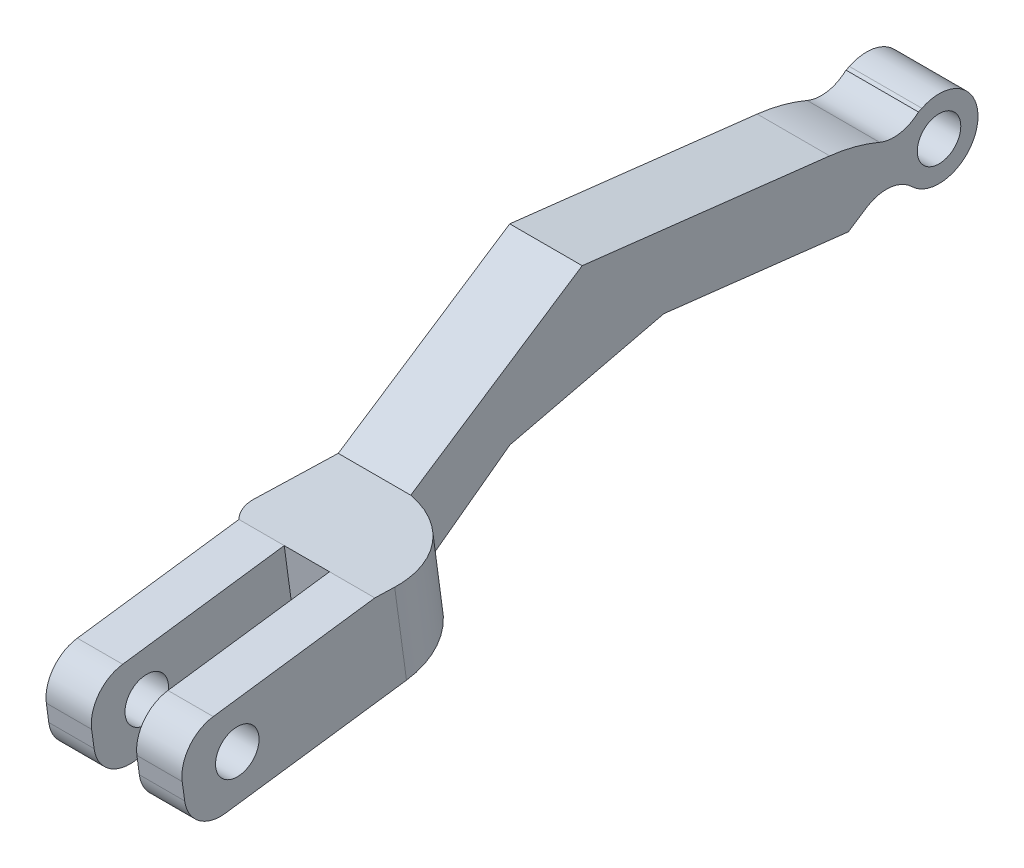
ISO-10303-21;
HEADER;
FILE_DESCRIPTION(('STEP AP214'),'2;1');
FILE_NAME('part.step','',(''),(''),'','','');
FILE_SCHEMA(('AUTOMOTIVE_DESIGN { 1 0 10303 214 1 1 1 1 }'));
ENDSEC;
DATA;
#1=APPLICATION_CONTEXT('core data for automotive mechanical design processes');
#2=APPLICATION_PROTOCOL_DEFINITION('international standard','automotive_design',2000,#1);
#3=PRODUCT_CONTEXT('',#1,'mechanical');
#4=PRODUCT('Part','Part','',(#3));
#5=PRODUCT_RELATED_PRODUCT_CATEGORY('part','',(#4));
#6=PRODUCT_DEFINITION_FORMATION('','',#4);
#7=PRODUCT_DEFINITION_CONTEXT('part definition',#1,'design');
#8=PRODUCT_DEFINITION('design','',#6,#7);
#9=PRODUCT_DEFINITION_SHAPE('','',#8);
#10=(LENGTH_UNIT() NAMED_UNIT(*) SI_UNIT(.MILLI.,.METRE.));
#11=(NAMED_UNIT(*) PLANE_ANGLE_UNIT() SI_UNIT($,.RADIAN.));
#12=(NAMED_UNIT(*) SI_UNIT($,.STERADIAN.) SOLID_ANGLE_UNIT());
#13=UNCERTAINTY_MEASURE_WITH_UNIT(LENGTH_MEASURE(1.E-05),#10,'distance_accuracy_value','');
#14=(GEOMETRIC_REPRESENTATION_CONTEXT(3) GLOBAL_UNCERTAINTY_ASSIGNED_CONTEXT((#13)) GLOBAL_UNIT_ASSIGNED_CONTEXT((#10,
#11,#12)) REPRESENTATION_CONTEXT('',''));
#15=CARTESIAN_POINT('',(0.,0.,0.));
#16=DIRECTION('',(0.,0.,1.));
#17=DIRECTION('',(1.,0.,0.));
#18=AXIS2_PLACEMENT_3D('',#15,#16,#17);
#19=CARTESIAN_POINT('',(2.,0.,0.));
#20=DIRECTION('',(1.,0.,0.));
#21=DIRECTION('',(0.,0.,-1.));
#22=AXIS2_PLACEMENT_3D('',#19,#20,#21);
#23=PLANE('',#22);
#24=CARTESIAN_POINT('',(2.,-2.82842712474619,-2.82842712474619));
#25=DIRECTION('',(1.,0.,0.));
#26=DIRECTION('',(0.,0.,-1.));
#27=AXIS2_PLACEMENT_3D('',#24,#25,#26);
#28=CIRCLE('',#27,1.2);
#29=CARTESIAN_POINT('',(2.,-2.82842712474619,-4.02842712474618));
#30=VERTEX_POINT('',#29);
#31=EDGE_CURVE('E308',#30,#30,#28,.T.);
#32=ORIENTED_EDGE('',*,*,#31,.F.);
#33=EDGE_LOOP('',(#32));
#34=FACE_BOUND('',#33,.T.);
#35=CARTESIAN_POINT('',(2.,0.484049290264182,-0.328427124746185));
#36=DIRECTION('',(1.,0.,0.));
#37=DIRECTION('',(0.,0.,-1.));
#38=AXIS2_PLACEMENT_3D('',#35,#36,#37);
#39=CIRCLE('',#38,2.);
#40=CARTESIAN_POINT('',(2.,-1.35709444230002,0.452719312254937));
#41=VERTEX_POINT('',#40);
#42=CARTESIAN_POINT('',(2.,-0.979731912227501,-1.69127142665011));
#43=VERTEX_POINT('',#42);
#44=EDGE_CURVE('E284',#41,#43,#39,.T.);
#45=ORIENTED_EDGE('',*,*,#44,.F.);
#46=CARTESIAN_POINT('',(2.,-10.562813105121,4.35845149726054));
#47=DIRECTION('',(1.,0.,0.));
#48=DIRECTION('',(0.,0.,-1.));
#49=AXIS2_PLACEMENT_3D('',#46,#47,#48);
#50=CIRCLE('',#49,10.);
#51=CARTESIAN_POINT('',(2.,-0.629231745712857,3.20781629181178));
#52=VERTEX_POINT('',#51);
#53=EDGE_CURVE('E63',#41,#52,#50,.T.);
#54=ORIENTED_EDGE('',*,*,#53,.T.);
#55=DIRECTION('',(0.,0.115063520544877,0.993358135940819));
#56=VECTOR('',#55,1.);
#57=CARTESIAN_POINT('',(2.,-0.987552066700199,0.114390986900482));
#58=LINE('',#57,#56);
#59=CARTESIAN_POINT('',(2.,0.952983865511063,16.8672866676453));
#60=VERTEX_POINT('',#59);
#61=EDGE_CURVE('E286',#52,#60,#58,.T.);
#62=ORIENTED_EDGE('',*,*,#61,.T.);
#63=DIRECTION('',(0.,-0.550374531244968,0.834917885397649));
#64=VECTOR('',#63,1.);
#65=CARTESIAN_POINT('',(2.,8.41512757073982,5.54721844281332));
#66=LINE('',#65,#64);
#67=CARTESIAN_POINT('',(2.,-5.28506014111271,26.3303962691135));
#68=VERTEX_POINT('',#67);
#69=EDGE_CURVE('E288',#60,#68,#66,.T.);
#70=ORIENTED_EDGE('',*,*,#69,.T.);
#71=DIRECTION('',(0.,-0.990856207200545,-0.134922113280778));
#72=VECTOR('',#71,1.);
#73=CARTESIAN_POINT('',(2.,-3.61627801369068,26.5576296553513));
#74=LINE('',#73,#72);
#75=CARTESIAN_POINT('',(2.,-9.24848496991489,25.7907078159904));
#76=VERTEX_POINT('',#75);
#77=EDGE_CURVE('E345',#68,#76,#74,.T.);
#78=ORIENTED_EDGE('',*,*,#77,.T.);
#79=DIRECTION('',(0.,-0.592706629550145,0.805418432423363));
#80=VECTOR('',#79,1.);
#81=CARTESIAN_POINT('',(2.,6.31240513743532,4.64529271090441));
#82=LINE('',#81,#80);
#83=CARTESIAN_POINT('',(2.,-5.61916698864485,20.8588925578094));
#84=VERTEX_POINT('',#83);
#85=EDGE_CURVE('E291',#84,#76,#82,.T.);
#86=ORIENTED_EDGE('',*,*,#85,.F.);
#87=DIRECTION('',(0.,-0.231624150850534,0.972805351929547));
#88=VECTOR('',#87,1.);
#89=CARTESIAN_POINT('',(2.,-5.61916698864485,20.8588925578094));
#90=LINE('',#89,#88);
#91=CARTESIAN_POINT('',(2.,-3.59576628097659,12.3607500701208));
#92=VERTEX_POINT('',#91);
#93=EDGE_CURVE('E419',#84,#92,#90,.F.);
#94=ORIENTED_EDGE('',*,*,#93,.T.);
#95=DIRECTION('',(0.,0.115063520544877,0.993358135940819));
#96=VECTOR('',#95,1.);
#97=CARTESIAN_POINT('',(2.,-4.96098461046348,0.574645069079989));
#98=LINE('',#97,#96);
#99=CARTESIAN_POINT('',(2.,-4.77600788476289,2.17157287525382));
#100=VERTEX_POINT('',#99);
#101=EDGE_CURVE('E293',#100,#92,#98,.T.);
#102=ORIENTED_EDGE('',*,*,#101,.F.);
#103=DIRECTION('',(0.,0.550374531244962,-0.834917885397653));
#104=VECTOR('',#103,1.);
#105=CARTESIAN_POINT('',(2.,-2.33142136393589,-1.53686363982916));
#106=LINE('',#105,#104);
#107=CARTESIAN_POINT('',(2.,-4.12127803589526,1.17834802582853));
#108=VERTEX_POINT('',#107);
#109=EDGE_CURVE('E296',#100,#108,#106,.T.);
#110=ORIENTED_EDGE('',*,*,#109,.T.);
#111=CARTESIAN_POINT('',(2.,-5.79111380669057,0.0775989633386117));
#112=DIRECTION('',(1.,0.,0.));
#113=DIRECTION('',(0.,0.,-1.));
#114=AXIS2_PLACEMENT_3D('',#111,#112,#113);
#115=CIRCLE('',#114,2.);
#116=CARTESIAN_POINT('',(2.,-4.36331299611497,-1.32289553694322));
#117=VERTEX_POINT('',#116);
#118=EDGE_CURVE('E299',#117,#108,#115,.T.);
#119=ORIENTED_EDGE('',*,*,#118,.F.);
#120=CARTESIAN_POINT('',(2.,-2.82842712474619,-2.82842712474619));
#121=DIRECTION('',(1.,0.,0.));
#122=DIRECTION('',(0.,0.,-1.));
#123=AXIS2_PLACEMENT_3D('',#120,#121,#122);
#124=CIRCLE('',#123,2.15);
#125=CARTESIAN_POINT('',(2.,-0.898489386493159,-1.88088275825628));
#126=VERTEX_POINT('',#125);
#127=EDGE_CURVE('E302',#117,#126,#124,.T.);
#128=ORIENTED_EDGE('',*,*,#127,.T.);
#129=CARTESIAN_POINT('',(2.,0.896801532811989,-0.999446138265666));
#130=DIRECTION('',(1.,0.,0.));
#131=DIRECTION('',(0.,0.,-1.));
#132=AXIS2_PLACEMENT_3D('',#129,#130,#131);
#133=CIRCLE('',#132,2.);
#134=EDGE_CURVE('E305',#43,#126,#133,.T.);
#135=ORIENTED_EDGE('',*,*,#134,.F.);
#136=EDGE_LOOP('',(#45,#54,#62,#70,#78,#86,#94,#102,#110,#119,#128,#135));
#137=FACE_BOUND('',#136,.T.);
#138=ADVANCED_FACE('F41',(#34,#137),#23,.T.);
#139=CARTESIAN_POINT('',(-2.,0.484049290264182,-0.328427124746185));
#140=DIRECTION('',(1.,0.,0.));
#141=DIRECTION('',(0.,0.,-1.));
#142=AXIS2_PLACEMENT_3D('',#139,#140,#141);
#143=CYLINDRICAL_SURFACE('',#142,2.);
#144=CARTESIAN_POINT('',(-2.,0.484049290264182,-0.328427124746185));
#145=DIRECTION('',(1.,0.,0.));
#146=DIRECTION('',(0.,0.,-1.));
#147=AXIS2_PLACEMENT_3D('',#144,#145,#146);
#148=CIRCLE('',#147,2.);
#149=CARTESIAN_POINT('',(-2.,-1.35709444230002,0.452719312254937));
#150=VERTEX_POINT('',#149);
#151=CARTESIAN_POINT('',(-2.,-0.979731912227501,-1.69127142665011));
#152=VERTEX_POINT('',#151);
#153=EDGE_CURVE('E311',#150,#152,#148,.T.);
#154=ORIENTED_EDGE('',*,*,#153,.F.);
#155=DIRECTION('',(1.,0.,0.));
#156=VECTOR('',#155,1.);
#157=CARTESIAN_POINT('',(-2.,-1.35709444230002,0.452719312254937));
#158=LINE('',#157,#156);
#159=EDGE_CURVE('E423',#150,#41,#158,.T.);
#160=ORIENTED_EDGE('',*,*,#159,.T.);
#161=ORIENTED_EDGE('',*,*,#44,.T.);
#162=DIRECTION('',(1.,0.,0.));
#163=VECTOR('',#162,1.);
#164=CARTESIAN_POINT('',(-2.,-0.979731912227501,-1.69127142665011));
#165=LINE('',#164,#163);
#166=EDGE_CURVE('E342',#152,#43,#165,.T.);
#167=ORIENTED_EDGE('',*,*,#166,.F.);
#168=EDGE_LOOP('',(#154,#160,#161,#167));
#169=FACE_BOUND('',#168,.T.);
#170=ADVANCED_FACE('F429',(#169),#143,.F.);
#171=CARTESIAN_POINT('',(-2.,0.896801532811989,-0.999446138265666));
#172=DIRECTION('',(1.,0.,0.));
#173=DIRECTION('',(0.,0.,-1.));
#174=AXIS2_PLACEMENT_3D('',#171,#172,#173);
#175=CYLINDRICAL_SURFACE('',#174,2.);
#176=ORIENTED_EDGE('',*,*,#166,.T.);
#177=ORIENTED_EDGE('',*,*,#134,.T.);
#178=DIRECTION('',(1.,0.,0.));
#179=VECTOR('',#178,1.);
#180=CARTESIAN_POINT('',(-2.,-0.898489386493159,-1.88088275825628));
#181=LINE('',#180,#179);
#182=CARTESIAN_POINT('',(-2.,-0.898489386493159,-1.88088275825628));
#183=VERTEX_POINT('',#182);
#184=EDGE_CURVE('E346',#183,#126,#181,.T.);
#185=ORIENTED_EDGE('',*,*,#184,.F.);
#186=CARTESIAN_POINT('',(-2.,0.896801532811989,-0.999446138265666));
#187=DIRECTION('',(1.,0.,0.));
#188=DIRECTION('',(0.,0.,-1.));
#189=AXIS2_PLACEMENT_3D('',#186,#187,#188);
#190=CIRCLE('',#189,2.);
#191=EDGE_CURVE('E336',#152,#183,#190,.T.);
#192=ORIENTED_EDGE('',*,*,#191,.F.);
#193=EDGE_LOOP('',(#176,#177,#185,#192));
#194=FACE_BOUND('',#193,.T.);
#195=ADVANCED_FACE('F438',(#194),#175,.F.);
#196=CARTESIAN_POINT('',(-2.,-2.82842712474619,-2.82842712474619));
#197=DIRECTION('',(1.,0.,0.));
#198=DIRECTION('',(0.,0.,-1.));
#199=AXIS2_PLACEMENT_3D('',#196,#197,#198);
#200=CYLINDRICAL_SURFACE('',#199,2.15);
#201=ORIENTED_EDGE('',*,*,#184,.T.);
#202=ORIENTED_EDGE('',*,*,#127,.F.);
#203=DIRECTION('',(1.,0.,0.));
#204=VECTOR('',#203,1.);
#205=CARTESIAN_POINT('',(-2.,-4.36331299611497,-1.32289553694322));
#206=LINE('',#205,#204);
#207=CARTESIAN_POINT('',(-2.,-4.36331299611497,-1.32289553694322));
#208=VERTEX_POINT('',#207);
#209=EDGE_CURVE('E348',#208,#117,#206,.T.);
#210=ORIENTED_EDGE('',*,*,#209,.F.);
#211=CARTESIAN_POINT('',(-2.,-2.82842712474619,-2.82842712474619));
#212=DIRECTION('',(1.,0.,0.));
#213=DIRECTION('',(0.,0.,-1.));
#214=AXIS2_PLACEMENT_3D('',#211,#212,#213);
#215=CIRCLE('',#214,2.15);
#216=EDGE_CURVE('E333',#208,#183,#215,.T.);
#217=ORIENTED_EDGE('',*,*,#216,.T.);
#218=EDGE_LOOP('',(#201,#202,#210,#217));
#219=FACE_BOUND('',#218,.T.);
#220=ADVANCED_FACE('F474',(#219),#200,.T.);
#221=CARTESIAN_POINT('',(-2.,-5.79111380669057,0.0775989633386117));
#222=DIRECTION('',(1.,0.,0.));
#223=DIRECTION('',(0.,0.,-1.));
#224=AXIS2_PLACEMENT_3D('',#221,#222,#223);
#225=CYLINDRICAL_SURFACE('',#224,2.);
#226=ORIENTED_EDGE('',*,*,#209,.T.);
#227=ORIENTED_EDGE('',*,*,#118,.T.);
#228=DIRECTION('',(1.,0.,0.));
#229=VECTOR('',#228,1.);
#230=CARTESIAN_POINT('',(-2.,-4.12127803589526,1.17834802582853));
#231=LINE('',#230,#229);
#232=CARTESIAN_POINT('',(-2.,-4.12127803589526,1.17834802582853));
#233=VERTEX_POINT('',#232);
#234=EDGE_CURVE('E350',#233,#108,#231,.T.);
#235=ORIENTED_EDGE('',*,*,#234,.F.);
#236=CARTESIAN_POINT('',(-2.,-5.79111380669057,0.0775989633386117));
#237=DIRECTION('',(1.,0.,0.));
#238=DIRECTION('',(0.,0.,-1.));
#239=AXIS2_PLACEMENT_3D('',#236,#237,#238);
#240=CIRCLE('',#239,2.);
#241=EDGE_CURVE('E331',#208,#233,#240,.T.);
#242=ORIENTED_EDGE('',*,*,#241,.F.);
#243=EDGE_LOOP('',(#226,#227,#235,#242));
#244=FACE_BOUND('',#243,.T.);
#245=ADVANCED_FACE('F477',(#244),#225,.F.);
#246=CARTESIAN_POINT('',(-2.,-2.33142136393589,-1.53686363982916));
#247=DIRECTION('',(0.,-0.834917885397653,-0.550374531244961));
#248=DIRECTION('',(0.,0.550374531244962,-0.834917885397653));
#249=AXIS2_PLACEMENT_3D('',#246,#247,#248);
#250=PLANE('',#249);
#251=ORIENTED_EDGE('',*,*,#234,.T.);
#252=ORIENTED_EDGE('',*,*,#109,.F.);
#253=DIRECTION('',(1.,0.,0.));
#254=VECTOR('',#253,1.);
#255=CARTESIAN_POINT('',(-2.,-4.77600788476289,2.17157287525382));
#256=LINE('',#255,#254);
#257=CARTESIAN_POINT('',(-2.,-4.77600788476289,2.17157287525382));
#258=VERTEX_POINT('',#257);
#259=EDGE_CURVE('E352',#258,#100,#256,.T.);
#260=ORIENTED_EDGE('',*,*,#259,.F.);
#261=DIRECTION('',(0.,0.550374531244962,-0.834917885397653));
#262=VECTOR('',#261,1.);
#263=CARTESIAN_POINT('',(-2.,-2.33142136393589,-1.53686363982916));
#264=LINE('',#263,#262);
#265=EDGE_CURVE('E328',#258,#233,#264,.T.);
#266=ORIENTED_EDGE('',*,*,#265,.T.);
#267=EDGE_LOOP('',(#251,#252,#260,#266));
#268=FACE_BOUND('',#267,.T.);
#269=ADVANCED_FACE('F481',(#268),#250,.T.);
#270=CARTESIAN_POINT('',(-2.,-4.96098461046348,0.574645069079989));
#271=DIRECTION('',(0.,0.993358135940819,-0.115063520544877));
#272=DIRECTION('',(0.,0.115063520544877,0.993358135940819));
#273=AXIS2_PLACEMENT_3D('',#270,#271,#272);
#274=PLANE('',#273);
#275=ORIENTED_EDGE('',*,*,#101,.T.);
#276=DIRECTION('',(-1.,0.,0.));
#277=VECTOR('',#276,1.);
#278=CARTESIAN_POINT('',(-2.,-3.59576628097659,12.3607500701208));
#279=LINE('',#278,#277);
#280=CARTESIAN_POINT('',(-2.,-3.59576628097659,12.3607500701208));
#281=VERTEX_POINT('',#280);
#282=EDGE_CURVE('E417',#92,#281,#279,.T.);
#283=ORIENTED_EDGE('',*,*,#282,.T.);
#284=DIRECTION('',(0.,0.115063520544877,0.993358135940819));
#285=VECTOR('',#284,1.);
#286=CARTESIAN_POINT('',(-2.,-4.96098461046348,0.574645069079989));
#287=LINE('',#286,#285);
#288=EDGE_CURVE('E325',#258,#281,#287,.T.);
#289=ORIENTED_EDGE('',*,*,#288,.F.);
#290=ORIENTED_EDGE('',*,*,#259,.T.);
#291=EDGE_LOOP('',(#275,#283,#289,#290));
#292=FACE_BOUND('',#291,.T.);
#293=ADVANCED_FACE('F485',(#292),#274,.F.);
#294=CARTESIAN_POINT('',(-2.,6.31240513743532,4.64529271090441));
#295=DIRECTION('',(0.,0.805418432423363,0.592706629550145));
#296=DIRECTION('',(0.,-0.592706629550145,0.805418432423363));
#297=AXIS2_PLACEMENT_3D('',#294,#295,#296);
#298=PLANE('',#297);
#299=DIRECTION('',(0.,-0.592706629550145,0.805418432423363));
#300=VECTOR('',#299,1.);
#301=CARTESIAN_POINT('',(-2.,6.31240513743532,4.64529271090441));
#302=LINE('',#301,#300);
#303=CARTESIAN_POINT('',(-2.,-5.61916698864485,20.8588925578094));
#304=VERTEX_POINT('',#303);
#305=CARTESIAN_POINT('',(-2.,-9.24848496991489,25.7907078159904));
#306=VERTEX_POINT('',#305);
#307=EDGE_CURVE('E323',#304,#306,#302,.T.);
#308=ORIENTED_EDGE('',*,*,#307,.F.);
#309=DIRECTION('',(1.,0.,0.));
#310=VECTOR('',#309,1.);
#311=CARTESIAN_POINT('',(2.,-5.61916698864485,20.8588925578094));
#312=LINE('',#311,#310);
#313=EDGE_CURVE('E414',#304,#84,#312,.T.);
#314=ORIENTED_EDGE('',*,*,#313,.T.);
#315=ORIENTED_EDGE('',*,*,#85,.T.);
#316=DIRECTION('',(1.,0.,0.));
#317=VECTOR('',#316,1.);
#318=CARTESIAN_POINT('',(-2.,-9.24848496991489,25.7907078159904));
#319=LINE('',#318,#317);
#320=EDGE_CURVE('E354',#306,#76,#319,.T.);
#321=ORIENTED_EDGE('',*,*,#320,.F.);
#322=EDGE_LOOP('',(#308,#314,#315,#321));
#323=FACE_BOUND('',#322,.T.);
#324=ADVANCED_FACE('F489',(#323),#298,.F.);
#325=CARTESIAN_POINT('',(-2.,-5.6322069562242,-0.766921839360963));
#326=DIRECTION('',(0.,0.990856207200545,0.134922113280778));
#327=DIRECTION('',(0.,-0.134922113280778,0.990856207200545));
#328=AXIS2_PLACEMENT_3D('',#325,#326,#327);
#329=PLANE('',#328);
#330=DIRECTION('',(0.,-0.134922113280778,0.990856207200545));
#331=VECTOR('',#330,1.);
#332=CARTESIAN_POINT('',(6.1,-5.6322069562242,-0.766921839360963));
#333=LINE('',#332,#331);
#334=CARTESIAN_POINT('',(6.1,-9.91207685896684,30.664068648597));
#335=VERTEX_POINT('',#334);
#336=CARTESIAN_POINT('',(6.1,-11.2723166691266,40.6535509239985));
#337=VERTEX_POINT('',#336);
#338=EDGE_CURVE('E249',#335,#337,#333,.T.);
#339=ORIENTED_EDGE('',*,*,#338,.T.);
#340=DIRECTION('',(-1.,0.,0.));
#341=VECTOR('',#340,1.);
#342=CARTESIAN_POINT('',(-2.,-11.2723166691266,40.6535509239985));
#343=LINE('',#342,#341);
#344=CARTESIAN_POINT('',(3.6,-11.2723166691266,40.6535509239985));
#345=VERTEX_POINT('',#344);
#346=EDGE_CURVE('E381',#337,#345,#343,.T.);
#347=ORIENTED_EDGE('',*,*,#346,.T.);
#348=DIRECTION('',(0.,-0.134922113280778,0.990856207200545));
#349=VECTOR('',#348,1.);
#350=CARTESIAN_POINT('',(3.6,-5.6322069562242,-0.766921839360963));
#351=LINE('',#350,#349);
#352=CARTESIAN_POINT('',(3.6,-10.0580176495996,31.7358450591937));
#353=VERTEX_POINT('',#352);
#354=EDGE_CURVE('E241',#353,#345,#351,.T.);
#355=ORIENTED_EDGE('',*,*,#354,.F.);
#356=DIRECTION('',(1.,0.,0.));
#357=VECTOR('',#356,1.);
#358=CARTESIAN_POINT('',(-2.,-10.0580176495996,31.7358450591937));
#359=LINE('',#358,#357);
#360=CARTESIAN_POINT('',(1.1,-10.0580176495996,31.7358450591936));
#361=VERTEX_POINT('',#360);
#362=EDGE_CURVE('E357',#361,#353,#359,.T.);
#363=ORIENTED_EDGE('',*,*,#362,.F.);
#364=DIRECTION('',(0.,-0.134922113280778,0.990856207200545));
#365=VECTOR('',#364,1.);
#366=CARTESIAN_POINT('',(1.1,-5.6322069562242,-0.766921839360963));
#367=LINE('',#366,#365);
#368=CARTESIAN_POINT('',(1.1,-11.2723166691266,40.6535509239985));
#369=VERTEX_POINT('',#368);
#370=EDGE_CURVE('E252',#361,#369,#367,.T.);
#371=ORIENTED_EDGE('',*,*,#370,.T.);
#372=DIRECTION('',(1.,0.,0.));
#373=VECTOR('',#372,1.);
#374=CARTESIAN_POINT('',(-1.4,-11.2723166691266,40.6535509239985));
#375=LINE('',#374,#373);
#376=CARTESIAN_POINT('',(-1.4,-11.2723166691266,40.6535509239985));
#377=VERTEX_POINT('',#376);
#378=EDGE_CURVE('E379',#369,#377,#375,.F.);
#379=ORIENTED_EDGE('',*,*,#378,.T.);
#380=DIRECTION('',(0.,-0.134922113280778,0.990856207200545));
#381=VECTOR('',#380,1.);
#382=CARTESIAN_POINT('',(-1.4,-5.6322069562242,-0.766921839360963));
#383=LINE('',#382,#381);
#384=CARTESIAN_POINT('',(-1.4,-10.0580176495996,31.7358450591936));
#385=VERTEX_POINT('',#384);
#386=EDGE_CURVE('E253',#385,#377,#383,.T.);
#387=ORIENTED_EDGE('',*,*,#386,.F.);
#388=CARTESIAN_POINT('',(0.,-9.86531032651507,30.3206193218536));
#389=DIRECTION('',(0.,0.990856207200545,0.134922113280778));
#390=DIRECTION('',(0.,-0.134922113280778,0.990856207200545));
#391=AXIS2_PLACEMENT_3D('',#388,#389,#390);
#392=CIRCLE('',#391,2.);
#393=CARTESIAN_POINT('',(-2.,-9.86531032651507,30.3206193218536));
#394=VERTEX_POINT('',#393);
#395=EDGE_CURVE('E368',#385,#394,#392,.F.);
#396=ORIENTED_EDGE('',*,*,#395,.T.);
#397=DIRECTION('',(0.,-0.134922113280778,0.990856207200545));
#398=VECTOR('',#397,1.);
#399=CARTESIAN_POINT('',(-2.,-5.6322069562242,-0.766921839360963));
#400=LINE('',#399,#398);
#401=EDGE_CURVE('E320',#306,#394,#400,.T.);
#402=ORIENTED_EDGE('',*,*,#401,.F.);
#403=ORIENTED_EDGE('',*,*,#320,.T.);
#404=CARTESIAN_POINT('',(1.1,-9.91207685896684,30.664068648597));
#405=DIRECTION('',(0.,0.990856207200545,0.134922113280778));
#406=DIRECTION('',(0.,-0.134922113280778,0.990856207200545));
#407=AXIS2_PLACEMENT_3D('',#404,#405,#406);
#408=CIRCLE('',#407,5.);
#409=EDGE_CURVE('E374',#76,#335,#408,.F.);
#410=ORIENTED_EDGE('',*,*,#409,.T.);
#411=EDGE_LOOP('',(#339,#347,#355,#363,#371,#379,#387,#396,#402,#403,#410));
#412=FACE_BOUND('',#411,.T.);
#413=ADVANCED_FACE('F493',(#412),#329,.F.);
#414=CARTESIAN_POINT('',(-2.,-4.42581069337535,32.5027668985546));
#415=DIRECTION('',(0.,-0.134922113280778,0.990856207200545));
#416=DIRECTION('',(0.,-0.990856207200545,-0.134922113280778));
#417=AXIS2_PLACEMENT_3D('',#414,#415,#416);
#418=PLANE('',#417);
#419=DIRECTION('',(0.,0.990856207200545,0.134922113280778));
#420=VECTOR('',#419,1.);
#421=CARTESIAN_POINT('',(1.1,-4.42581069337535,32.5027668985546));
#422=LINE('',#421,#420);
#423=CARTESIAN_POINT('',(1.1,-5.10373661359683,32.4104556255975));
#424=VERTEX_POINT('',#423);
#425=EDGE_CURVE('E278',#361,#424,#422,.T.);
#426=ORIENTED_EDGE('',*,*,#425,.F.);
#427=ORIENTED_EDGE('',*,*,#362,.T.);
#428=DIRECTION('',(0.,0.990856207200545,0.134922113280778));
#429=VECTOR('',#428,1.);
#430=CARTESIAN_POINT('',(3.6,-4.42581069337535,32.5027668985546));
#431=LINE('',#430,#429);
#432=CARTESIAN_POINT('',(3.6,-5.10373661359683,32.4104556255975));
#433=VERTEX_POINT('',#432);
#434=EDGE_CURVE('E222',#353,#433,#431,.T.);
#435=ORIENTED_EDGE('',*,*,#434,.T.);
#436=DIRECTION('',(1.,0.,0.));
#437=VECTOR('',#436,1.);
#438=CARTESIAN_POINT('',(-2.,-5.10373661359683,32.4104556255975));
#439=LINE('',#438,#437);
#440=EDGE_CURVE('E218',#424,#433,#439,.T.);
#441=ORIENTED_EDGE('',*,*,#440,.F.);
#442=EDGE_LOOP('',(#426,#427,#435,#441));
#443=FACE_BOUND('',#442,.T.);
#444=ADVANCED_FACE('F497',(#443),#418,.T.);
#445=CARTESIAN_POINT('',(-2.,-6.06490845541673,0.180871687383158));
#446=DIRECTION('',(0.,-0.99955560096244,0.0298094042982452));
#447=DIRECTION('',(0.,-0.0298094042982452,-0.99955560096244));
#448=AXIS2_PLACEMENT_3D('',#445,#446,#447);
#449=PLANE('',#448);
#450=DIRECTION('',(0.,-0.0298094042982452,-0.99955560096244));
#451=VECTOR('',#450,1.);
#452=CARTESIAN_POINT('',(6.1,-6.06490845541673,0.180871687383158));
#453=LINE('',#452,#451);
#454=CARTESIAN_POINT('',(6.1,-5.10373661359683,32.4104556255975));
#455=VERTEX_POINT('',#454);
#456=CARTESIAN_POINT('',(6.1,-5.13642522473022,31.3143557498955));
#457=VERTEX_POINT('',#456);
#458=EDGE_CURVE('E214',#455,#457,#453,.T.);
#459=ORIENTED_EDGE('',*,*,#458,.T.);
#460=CARTESIAN_POINT('',(1.1,-5.13642522473022,31.3143557498955));
#461=DIRECTION('',(0.,-0.99955560096244,0.0298094042982452));
#462=DIRECTION('',(0.,0.0298094042982452,0.99955560096244));
#463=AXIS2_PLACEMENT_3D('',#460,#461,#462);
#464=ELLIPSE('',#463,5.06896877524852,5.);
#465=EDGE_CURVE('E377',#457,#68,#464,.F.);
#466=ORIENTED_EDGE('',*,*,#465,.T.);
#467=DIRECTION('',(1.,0.,0.));
#468=VECTOR('',#467,1.);
#469=CARTESIAN_POINT('',(-2.,-5.28506014111271,26.3303962691135));
#470=LINE('',#469,#468);
#471=CARTESIAN_POINT('',(-2.,-5.28506014111271,26.3303962691135));
#472=VERTEX_POINT('',#471);
#473=EDGE_CURVE('E361',#472,#68,#470,.T.);
#474=ORIENTED_EDGE('',*,*,#473,.F.);
#475=DIRECTION('',(0.,-0.0298094042982452,-0.99955560096244));
#476=VECTOR('',#475,1.);
#477=CARTESIAN_POINT('',(-2.,-6.06490845541673,0.180871687383158));
#478=LINE('',#477,#476);
#479=CARTESIAN_POINT('',(-2.,-5.14690024673568,30.9631120010768));
#480=VERTEX_POINT('',#479);
#481=EDGE_CURVE('E318',#480,#472,#478,.T.);
#482=ORIENTED_EDGE('',*,*,#481,.F.);
#483=CARTESIAN_POINT('',(0.,-5.14690024673568,30.9631120010768));
#484=DIRECTION('',(0.,-0.99955560096244,0.0298094042982452));
#485=DIRECTION('',(0.,0.0298094042982452,0.99955560096244));
#486=AXIS2_PLACEMENT_3D('',#483,#484,#485);
#487=ELLIPSE('',#486,2.02758751009941,2.);
#488=CARTESIAN_POINT('',(-1.4,-5.10373661359683,32.4104556255975));
#489=VERTEX_POINT('',#488);
#490=EDGE_CURVE('E372',#480,#489,#487,.F.);
#491=ORIENTED_EDGE('',*,*,#490,.T.);
#492=DIRECTION('',(1.,0.,0.));
#493=VECTOR('',#492,1.);
#494=CARTESIAN_POINT('',(-1.4,-5.10373661359683,32.4104556255975));
#495=LINE('',#494,#493);
#496=EDGE_CURVE('E266',#489,#424,#495,.T.);
#497=ORIENTED_EDGE('',*,*,#496,.T.);
#498=ORIENTED_EDGE('',*,*,#440,.T.);
#499=DIRECTION('',(-1.,0.,0.));
#500=VECTOR('',#499,1.);
#501=CARTESIAN_POINT('',(6.1,-5.10373661359683,32.4104556255975));
#502=LINE('',#501,#500);
#503=EDGE_CURVE('E210',#455,#433,#502,.T.);
#504=ORIENTED_EDGE('',*,*,#503,.F.);
#505=EDGE_LOOP('',(#459,#466,#474,#482,#491,#497,#498,#504));
#506=FACE_BOUND('',#505,.T.);
#507=ADVANCED_FACE('F212',(#506),#449,.F.);
#508=CARTESIAN_POINT('',(-2.,8.41512757073982,5.54721844281332));
#509=DIRECTION('',(0.,0.834917885397649,0.550374531244968));
#510=DIRECTION('',(0.,-0.550374531244968,0.834917885397649));
#511=AXIS2_PLACEMENT_3D('',#508,#509,#510);
#512=PLANE('',#511);
#513=ORIENTED_EDGE('',*,*,#473,.T.);
#514=ORIENTED_EDGE('',*,*,#69,.F.);
#515=DIRECTION('',(1.,0.,0.));
#516=VECTOR('',#515,1.);
#517=CARTESIAN_POINT('',(-2.,0.952983865511063,16.8672866676453));
#518=LINE('',#517,#516);
#519=CARTESIAN_POINT('',(-2.,0.952983865511063,16.8672866676453));
#520=VERTEX_POINT('',#519);
#521=EDGE_CURVE('E341',#520,#60,#518,.T.);
#522=ORIENTED_EDGE('',*,*,#521,.F.);
#523=DIRECTION('',(0.,-0.550374531244968,0.834917885397649));
#524=VECTOR('',#523,1.);
#525=CARTESIAN_POINT('',(-2.,8.41512757073982,5.54721844281332));
#526=LINE('',#525,#524);
#527=EDGE_CURVE('E315',#520,#472,#526,.T.);
#528=ORIENTED_EDGE('',*,*,#527,.T.);
#529=EDGE_LOOP('',(#513,#514,#522,#528));
#530=FACE_BOUND('',#529,.T.);
#531=ADVANCED_FACE('F504',(#530),#512,.T.);
#532=CARTESIAN_POINT('',(-2.,-0.987552066700199,0.114390986900482));
#533=DIRECTION('',(0.,0.993358135940819,-0.115063520544877));
#534=DIRECTION('',(0.,0.115063520544877,0.993358135940819));
#535=AXIS2_PLACEMENT_3D('',#532,#533,#534);
#536=PLANE('',#535);
#537=ORIENTED_EDGE('',*,*,#61,.F.);
#538=DIRECTION('',(-1.,0.,0.));
#539=VECTOR('',#538,1.);
#540=CARTESIAN_POINT('',(-2.,-0.629231745712857,3.20781629181178));
#541=LINE('',#540,#539);
#542=CARTESIAN_POINT('',(-2.,-0.629231745712857,3.20781629181178));
#543=VERTEX_POINT('',#542);
#544=EDGE_CURVE('E49',#52,#543,#541,.T.);
#545=ORIENTED_EDGE('',*,*,#544,.T.);
#546=DIRECTION('',(0.,0.115063520544877,0.993358135940819));
#547=VECTOR('',#546,1.);
#548=CARTESIAN_POINT('',(-2.,-0.987552066700199,0.114390986900482));
#549=LINE('',#548,#547);
#550=EDGE_CURVE('E313',#543,#520,#549,.T.);
#551=ORIENTED_EDGE('',*,*,#550,.T.);
#552=ORIENTED_EDGE('',*,*,#521,.T.);
#553=EDGE_LOOP('',(#537,#545,#551,#552));
#554=FACE_BOUND('',#553,.T.);
#555=ADVANCED_FACE('F470',(#554),#536,.T.);
#556=CARTESIAN_POINT('',(-2.,-2.82842712474619,-2.82842712474619));
#557=DIRECTION('',(1.,0.,0.));
#558=DIRECTION('',(0.,0.,-1.));
#559=AXIS2_PLACEMENT_3D('',#556,#557,#558);
#560=CYLINDRICAL_SURFACE('',#559,1.2);
#561=CARTESIAN_POINT('',(-2.,-2.82842712474619,-2.82842712474619));
#562=DIRECTION('',(1.,0.,0.));
#563=DIRECTION('',(0.,0.,-1.));
#564=AXIS2_PLACEMENT_3D('',#561,#562,#563);
#565=CIRCLE('',#564,1.2);
#566=CARTESIAN_POINT('',(-2.,-2.82842712474619,-4.02842712474618));
#567=VERTEX_POINT('',#566);
#568=EDGE_CURVE('E338',#567,#567,#565,.T.);
#569=ORIENTED_EDGE('',*,*,#568,.F.);
#570=EDGE_LOOP('',(#569));
#571=FACE_BOUND('',#570,.T.);
#572=ORIENTED_EDGE('',*,*,#31,.T.);
#573=EDGE_LOOP('',(#572));
#574=FACE_BOUND('',#573,.T.);
#575=ADVANCED_FACE('F467',(#571,#574),#560,.F.);
#576=CARTESIAN_POINT('',(-2.,0.,0.));
#577=DIRECTION('',(1.,0.,0.));
#578=DIRECTION('',(0.,0.,-1.));
#579=AXIS2_PLACEMENT_3D('',#576,#577,#578);
#580=PLANE('',#579);
#581=ORIENTED_EDGE('',*,*,#550,.F.);
#582=CARTESIAN_POINT('',(-2.,-10.562813105121,4.35845149726054));
#583=DIRECTION('',(1.,0.,0.));
#584=DIRECTION('',(0.,0.,-1.));
#585=AXIS2_PLACEMENT_3D('',#582,#583,#584);
#586=CIRCLE('',#585,10.);
#587=EDGE_CURVE('E11',#543,#150,#586,.F.);
#588=ORIENTED_EDGE('',*,*,#587,.T.);
#589=ORIENTED_EDGE('',*,*,#153,.T.);
#590=ORIENTED_EDGE('',*,*,#191,.T.);
#591=ORIENTED_EDGE('',*,*,#216,.F.);
#592=ORIENTED_EDGE('',*,*,#241,.T.);
#593=ORIENTED_EDGE('',*,*,#265,.F.);
#594=ORIENTED_EDGE('',*,*,#288,.T.);
#595=DIRECTION('',(0.,0.231624150850534,-0.972805351929547));
#596=VECTOR('',#595,1.);
#597=CARTESIAN_POINT('',(-2.,-0.617665679203453,-0.147065688085749));
#598=LINE('',#597,#596);
#599=EDGE_CURVE('E421',#281,#304,#598,.F.);
#600=ORIENTED_EDGE('',*,*,#599,.T.);
#601=ORIENTED_EDGE('',*,*,#307,.T.);
#602=ORIENTED_EDGE('',*,*,#401,.T.);
#603=DIRECTION('',(0.,0.990856207200545,0.134922113280778));
#604=VECTOR('',#603,1.);
#605=CARTESIAN_POINT('',(-2.,-4.23310337029086,31.0875411612146));
#606=LINE('',#605,#604);
#607=EDGE_CURVE('E370',#394,#480,#606,.T.);
#608=ORIENTED_EDGE('',*,*,#607,.T.);
#609=ORIENTED_EDGE('',*,*,#481,.T.);
#610=ORIENTED_EDGE('',*,*,#527,.F.);
#611=EDGE_LOOP('',(#581,#588,#589,#590,#591,#592,#593,#594,#600,#601,#602,#608,#609,#610));
#612=FACE_BOUND('',#611,.T.);
#613=ORIENTED_EDGE('',*,*,#568,.T.);
#614=EDGE_LOOP('',(#613));
#615=FACE_BOUND('',#614,.T.);
#616=ADVANCED_FACE('F442',(#612,#615),#580,.F.);
#617=CARTESIAN_POINT('',(-1.4,-5.90995393946395,43.4021851777606));
#618=DIRECTION('',(0.,-0.134922113280779,0.990856207200545));
#619=DIRECTION('',(0.,-0.990856207200545,-0.134922113280779));
#620=AXIS2_PLACEMENT_3D('',#617,#618,#619);
#621=PLANE('',#620);
#622=DIRECTION('',(0.,-0.990856207200545,-0.134922113280779));
#623=VECTOR('',#622,1.);
#624=CARTESIAN_POINT('',(-1.4,-5.90995393946395,43.4021851777606));
#625=LINE('',#624,#623);
#626=CARTESIAN_POINT('',(-1.4,-8.56959227408648,43.040029678242));
#627=VERTEX_POINT('',#626);
#628=CARTESIAN_POINT('',(-1.4,-9.56044848128703,42.9051075649612));
#629=VERTEX_POINT('',#628);
#630=EDGE_CURVE('E260',#627,#629,#625,.T.);
#631=ORIENTED_EDGE('',*,*,#630,.T.);
#632=DIRECTION('',(1.,0.,0.));
#633=VECTOR('',#632,1.);
#634=CARTESIAN_POINT('',(1.1,-9.56044848128703,42.9051075649612));
#635=LINE('',#634,#633);
#636=CARTESIAN_POINT('',(1.1,-9.56044848128703,42.9051075649612));
#637=VERTEX_POINT('',#636);
#638=EDGE_CURVE('E399',#629,#637,#635,.T.);
#639=ORIENTED_EDGE('',*,*,#638,.T.);
#640=DIRECTION('',(0.,-0.990856207200545,-0.134922113280779));
#641=VECTOR('',#640,1.);
#642=CARTESIAN_POINT('',(1.1,-5.90995393946395,43.4021851777606));
#643=LINE('',#642,#641);
#644=CARTESIAN_POINT('',(1.1,-8.56959227408648,43.040029678242));
#645=VERTEX_POINT('',#644);
#646=EDGE_CURVE('E272',#645,#637,#643,.T.);
#647=ORIENTED_EDGE('',*,*,#646,.F.);
#648=DIRECTION('',(1.,0.,0.));
#649=VECTOR('',#648,1.);
#650=CARTESIAN_POINT('',(-1.4,-8.56959227408648,43.040029678242));
#651=LINE('',#650,#649);
#652=EDGE_CURVE('E397',#645,#627,#651,.F.);
#653=ORIENTED_EDGE('',*,*,#652,.T.);
#654=EDGE_LOOP('',(#631,#639,#647,#653));
#655=FACE_BOUND('',#654,.T.);
#656=ADVANCED_FACE('F466',(#655),#621,.T.);
#657=CARTESIAN_POINT('',(-1.4,-0.67792592022149,-0.092311272957073));
#658=DIRECTION('',(0.,0.990856207200545,0.134922113280778));
#659=DIRECTION('',(0.,-0.134922113280778,0.990856207200545));
#660=AXIS2_PLACEMENT_3D('',#657,#658,#659);
#661=PLANE('',#660);
#662=DIRECTION('',(0.,-0.134922113280778,0.990856207200545));
#663=VECTOR('',#662,1.);
#664=CARTESIAN_POINT('',(-1.4,-0.67792592022149,-0.092311272957073));
#665=LINE('',#664,#663);
#666=CARTESIAN_POINT('',(-1.4,-6.31803563312384,41.3281614904024));
#667=VERTEX_POINT('',#666);
#668=EDGE_CURVE('E256',#489,#667,#665,.T.);
#669=ORIENTED_EDGE('',*,*,#668,.T.);
#670=DIRECTION('',(1.,0.,0.));
#671=VECTOR('',#670,1.);
#672=CARTESIAN_POINT('',(-1.4,-6.31803563312384,41.3281614904024));
#673=LINE('',#672,#671);
#674=CARTESIAN_POINT('',(1.1,-6.31803563312384,41.3281614904024));
#675=VERTEX_POINT('',#674);
#676=EDGE_CURVE('E410',#667,#675,#673,.T.);
#677=ORIENTED_EDGE('',*,*,#676,.T.);
#678=DIRECTION('',(0.,-0.134922113280778,0.990856207200545));
#679=VECTOR('',#678,1.);
#680=CARTESIAN_POINT('',(1.1,-0.67792592022149,-0.092311272957073));
#681=LINE('',#680,#679);
#682=EDGE_CURVE('E269',#424,#675,#681,.T.);
#683=ORIENTED_EDGE('',*,*,#682,.F.);
#684=ORIENTED_EDGE('',*,*,#496,.F.);
#685=EDGE_LOOP('',(#669,#677,#683,#684));
#686=FACE_BOUND('',#685,.T.);
#687=ADVANCED_FACE('F462',(#686),#661,.T.);
#688=CARTESIAN_POINT('',(-1.4,-8.66025403784442,40.));
#689=DIRECTION('',(1.,0.,0.));
#690=DIRECTION('',(0.,0.,-1.));
#691=AXIS2_PLACEMENT_3D('',#688,#689,#690);
#692=CYLINDRICAL_SURFACE('',#691,1.2);
#693=CARTESIAN_POINT('',(-1.4,-8.66025403784442,40.));
#694=DIRECTION('',(1.,0.,0.));
#695=DIRECTION('',(0.,0.,-1.));
#696=AXIS2_PLACEMENT_3D('',#693,#694,#695);
#697=CIRCLE('',#696,1.2);
#698=CARTESIAN_POINT('',(-1.4,-8.66025403784442,38.8));
#699=VERTEX_POINT('',#698);
#700=EDGE_CURVE('E263',#699,#699,#697,.T.);
#701=ORIENTED_EDGE('',*,*,#700,.F.);
#702=EDGE_LOOP('',(#701));
#703=FACE_BOUND('',#702,.T.);
#704=CARTESIAN_POINT('',(1.1,-8.66025403784442,40.));
#705=DIRECTION('',(1.,0.,0.));
#706=DIRECTION('',(0.,0.,-1.));
#707=AXIS2_PLACEMENT_3D('',#704,#705,#706);
#708=CIRCLE('',#707,1.2);
#709=CARTESIAN_POINT('',(1.1,-8.66025403784442,38.8));
#710=VERTEX_POINT('',#709);
#711=EDGE_CURVE('E257',#710,#710,#708,.T.);
#712=ORIENTED_EDGE('',*,*,#711,.T.);
#713=EDGE_LOOP('',(#712));
#714=FACE_BOUND('',#713,.T.);
#715=ADVANCED_FACE('F577',(#703,#714),#692,.F.);
#716=CARTESIAN_POINT('',(-1.4,0.,0.));
#717=DIRECTION('',(1.,0.,0.));
#718=DIRECTION('',(0.,0.,-1.));
#719=AXIS2_PLACEMENT_3D('',#716,#717,#718);
#720=PLANE('',#719);
#721=ORIENTED_EDGE('',*,*,#386,.T.);
#722=CARTESIAN_POINT('',(-1.4,-9.29060425472547,40.9233951505601));
#723=DIRECTION('',(1.,0.,0.));
#724=DIRECTION('',(0.,0.,-1.));
#725=AXIS2_PLACEMENT_3D('',#722,#723,#724);
#726=CIRCLE('',#725,2.);
#727=EDGE_CURVE('E408',#377,#629,#726,.F.);
#728=ORIENTED_EDGE('',*,*,#727,.T.);
#729=ORIENTED_EDGE('',*,*,#630,.F.);
#730=CARTESIAN_POINT('',(-1.4,-8.29974804752492,41.0583172638409));
#731=DIRECTION('',(1.,0.,0.));
#732=DIRECTION('',(0.,0.,-1.));
#733=AXIS2_PLACEMENT_3D('',#730,#731,#732);
#734=CIRCLE('',#733,2.);
#735=EDGE_CURVE('E406',#627,#667,#734,.F.);
#736=ORIENTED_EDGE('',*,*,#735,.T.);
#737=ORIENTED_EDGE('',*,*,#668,.F.);
#738=DIRECTION('',(0.,0.990856207200545,0.134922113280778));
#739=VECTOR('',#738,1.);
#740=CARTESIAN_POINT('',(-1.4,-4.42581069337535,32.5027668985546));
#741=LINE('',#740,#739);
#742=EDGE_CURVE('E281',#385,#489,#741,.T.);
#743=ORIENTED_EDGE('',*,*,#742,.F.);
#744=EDGE_LOOP('',(#721,#728,#729,#736,#737,#743));
#745=FACE_BOUND('',#744,.T.);
#746=ORIENTED_EDGE('',*,*,#700,.T.);
#747=EDGE_LOOP('',(#746));
#748=FACE_BOUND('',#747,.T.);
#749=ADVANCED_FACE('F574',(#745,#748),#720,.F.);
#750=CARTESIAN_POINT('',(1.1,0.,0.));
#751=DIRECTION('',(1.,0.,0.));
#752=DIRECTION('',(0.,0.,-1.));
#753=AXIS2_PLACEMENT_3D('',#750,#751,#752);
#754=PLANE('',#753);
#755=ORIENTED_EDGE('',*,*,#646,.T.);
#756=CARTESIAN_POINT('',(1.1,-9.29060425472547,40.9233951505601));
#757=DIRECTION('',(1.,0.,0.));
#758=DIRECTION('',(0.,0.,-1.));
#759=AXIS2_PLACEMENT_3D('',#756,#757,#758);
#760=CIRCLE('',#759,2.);
#761=EDGE_CURVE('E404',#637,#369,#760,.T.);
#762=ORIENTED_EDGE('',*,*,#761,.T.);
#763=ORIENTED_EDGE('',*,*,#370,.F.);
#764=ORIENTED_EDGE('',*,*,#425,.T.);
#765=ORIENTED_EDGE('',*,*,#682,.T.);
#766=CARTESIAN_POINT('',(1.1,-8.29974804752492,41.0583172638409));
#767=DIRECTION('',(1.,0.,0.));
#768=DIRECTION('',(0.,0.,-1.));
#769=AXIS2_PLACEMENT_3D('',#766,#767,#768);
#770=CIRCLE('',#769,2.);
#771=EDGE_CURVE('E402',#675,#645,#770,.T.);
#772=ORIENTED_EDGE('',*,*,#771,.T.);
#773=EDGE_LOOP('',(#755,#762,#763,#764,#765,#772));
#774=FACE_BOUND('',#773,.T.);
#775=ORIENTED_EDGE('',*,*,#711,.F.);
#776=EDGE_LOOP('',(#775));
#777=FACE_BOUND('',#776,.T.);
#778=ADVANCED_FACE('F571',(#774,#777),#754,.T.);
#779=CARTESIAN_POINT('',(6.1,-0.67792592022149,-0.092311272957073));
#780=DIRECTION('',(0.,-0.990856207200545,-0.134922113280778));
#781=DIRECTION('',(0.,0.134922113280778,-0.990856207200545));
#782=AXIS2_PLACEMENT_3D('',#779,#780,#781);
#783=PLANE('',#782);
#784=DIRECTION('',(0.,-0.134922113280778,0.990856207200545));
#785=VECTOR('',#784,1.);
#786=CARTESIAN_POINT('',(3.6,-0.67792592022149,-0.092311272957073));
#787=LINE('',#786,#785);
#788=CARTESIAN_POINT('',(3.6,-6.31803563312384,41.3281614904024));
#789=VERTEX_POINT('',#788);
#790=EDGE_CURVE('E248',#433,#789,#787,.T.);
#791=ORIENTED_EDGE('',*,*,#790,.T.);
#792=DIRECTION('',(-1.,0.,0.));
#793=VECTOR('',#792,1.);
#794=CARTESIAN_POINT('',(6.1,-6.31803563312384,41.3281614904024));
#795=LINE('',#794,#793);
#796=CARTESIAN_POINT('',(6.1,-6.31803563312384,41.3281614904024));
#797=VERTEX_POINT('',#796);
#798=EDGE_CURVE('E228',#789,#797,#795,.F.);
#799=ORIENTED_EDGE('',*,*,#798,.T.);
#800=DIRECTION('',(0.,-0.134922113280778,0.990856207200545));
#801=VECTOR('',#800,1.);
#802=CARTESIAN_POINT('',(6.1,-0.67792592022149,-0.092311272957073));
#803=LINE('',#802,#801);
#804=EDGE_CURVE('E225',#455,#797,#803,.T.);
#805=ORIENTED_EDGE('',*,*,#804,.F.);
#806=ORIENTED_EDGE('',*,*,#503,.T.);
#807=EDGE_LOOP('',(#791,#799,#805,#806));
#808=FACE_BOUND('',#807,.T.);
#809=ADVANCED_FACE('F226',(#808),#783,.F.);
#810=CARTESIAN_POINT('',(6.1,-5.90995393946395,43.4021851777606));
#811=DIRECTION('',(0.,0.134922113280779,-0.990856207200545));
#812=DIRECTION('',(0.,0.990856207200545,0.134922113280779));
#813=AXIS2_PLACEMENT_3D('',#810,#811,#812);
#814=PLANE('',#813);
#815=DIRECTION('',(0.,-0.990856207200545,-0.134922113280779));
#816=VECTOR('',#815,1.);
#817=CARTESIAN_POINT('',(3.6,-5.90995393946395,43.4021851777606));
#818=LINE('',#817,#816);
#819=CARTESIAN_POINT('',(3.6,-8.56959227408648,43.040029678242));
#820=VERTEX_POINT('',#819);
#821=CARTESIAN_POINT('',(3.6,-9.56044848128703,42.9051075649612));
#822=VERTEX_POINT('',#821);
#823=EDGE_CURVE('E244',#820,#822,#818,.T.);
#824=ORIENTED_EDGE('',*,*,#823,.T.);
#825=DIRECTION('',(-1.,0.,0.));
#826=VECTOR('',#825,1.);
#827=CARTESIAN_POINT('',(6.1,-9.56044848128703,42.9051075649612));
#828=LINE('',#827,#826);
#829=CARTESIAN_POINT('',(6.1,-9.56044848128703,42.9051075649612));
#830=VERTEX_POINT('',#829);
#831=EDGE_CURVE('E391',#822,#830,#828,.F.);
#832=ORIENTED_EDGE('',*,*,#831,.T.);
#833=DIRECTION('',(0.,-0.990856207200545,-0.134922113280779));
#834=VECTOR('',#833,1.);
#835=CARTESIAN_POINT('',(6.1,-5.90995393946395,43.4021851777606));
#836=LINE('',#835,#834);
#837=CARTESIAN_POINT('',(6.1,-8.56959227408648,43.040029678242));
#838=VERTEX_POINT('',#837);
#839=EDGE_CURVE('E231',#838,#830,#836,.T.);
#840=ORIENTED_EDGE('',*,*,#839,.F.);
#841=DIRECTION('',(-1.,0.,0.));
#842=VECTOR('',#841,1.);
#843=CARTESIAN_POINT('',(6.1,-8.56959227408648,43.040029678242));
#844=LINE('',#843,#842);
#845=EDGE_CURVE('E388',#838,#820,#844,.T.);
#846=ORIENTED_EDGE('',*,*,#845,.T.);
#847=EDGE_LOOP('',(#824,#832,#840,#846));
#848=FACE_BOUND('',#847,.T.);
#849=ADVANCED_FACE('F542',(#848),#814,.F.);
#850=CARTESIAN_POINT('',(6.1,0.,0.));
#851=DIRECTION('',(1.,0.,0.));
#852=DIRECTION('',(0.,0.,-1.));
#853=AXIS2_PLACEMENT_3D('',#850,#851,#852);
#854=PLANE('',#853);
#855=CARTESIAN_POINT('',(6.1,-8.66025403784442,40.));
#856=DIRECTION('',(-1.,0.,0.));
#857=DIRECTION('',(0.,0.,1.));
#858=AXIS2_PLACEMENT_3D('',#855,#856,#857);
#859=CIRCLE('',#858,1.2);
#860=CARTESIAN_POINT('',(6.1,-8.66025403784442,41.2));
#861=VERTEX_POINT('',#860);
#862=EDGE_CURVE('E245',#861,#861,#859,.T.);
#863=ORIENTED_EDGE('',*,*,#862,.T.);
#864=EDGE_LOOP('',(#863));
#865=FACE_BOUND('',#864,.T.);
#866=ORIENTED_EDGE('',*,*,#839,.T.);
#867=CARTESIAN_POINT('',(6.1,-9.29060425472547,40.9233951505601));
#868=DIRECTION('',(1.,0.,0.));
#869=DIRECTION('',(0.,0.,-1.));
#870=AXIS2_PLACEMENT_3D('',#867,#868,#869);
#871=CIRCLE('',#870,2.);
#872=EDGE_CURVE('E395',#830,#337,#871,.T.);
#873=ORIENTED_EDGE('',*,*,#872,.T.);
#874=ORIENTED_EDGE('',*,*,#338,.F.);
#875=DIRECTION('',(0.,-0.990856207200545,-0.134922113280778));
#876=VECTOR('',#875,1.);
#877=CARTESIAN_POINT('',(6.1,-5.94865203016466,31.2037571017201));
#878=LINE('',#877,#876);
#879=EDGE_CURVE('E237',#335,#457,#878,.F.);
#880=ORIENTED_EDGE('',*,*,#879,.T.);
#881=ORIENTED_EDGE('',*,*,#458,.F.);
#882=ORIENTED_EDGE('',*,*,#804,.T.);
#883=CARTESIAN_POINT('',(6.1,-8.29974804752492,41.0583172638409));
#884=DIRECTION('',(1.,0.,0.));
#885=DIRECTION('',(0.,0.,-1.));
#886=AXIS2_PLACEMENT_3D('',#883,#884,#885);
#887=CIRCLE('',#886,2.);
#888=EDGE_CURVE('E393',#797,#838,#887,.T.);
#889=ORIENTED_EDGE('',*,*,#888,.T.);
#890=EDGE_LOOP('',(#866,#873,#874,#880,#881,#882,#889));
#891=FACE_BOUND('',#890,.T.);
#892=ADVANCED_FACE('F234',(#865,#891),#854,.T.);
#893=CARTESIAN_POINT('',(3.6,0.,0.));
#894=DIRECTION('',(1.,0.,0.));
#895=DIRECTION('',(0.,0.,-1.));
#896=AXIS2_PLACEMENT_3D('',#893,#894,#895);
#897=PLANE('',#896);
#898=ORIENTED_EDGE('',*,*,#354,.T.);
#899=CARTESIAN_POINT('',(3.6,-9.29060425472547,40.9233951505601));
#900=DIRECTION('',(1.,0.,0.));
#901=DIRECTION('',(0.,0.,-1.));
#902=AXIS2_PLACEMENT_3D('',#899,#900,#901);
#903=CIRCLE('',#902,2.);
#904=EDGE_CURVE('E386',#345,#822,#903,.F.);
#905=ORIENTED_EDGE('',*,*,#904,.T.);
#906=ORIENTED_EDGE('',*,*,#823,.F.);
#907=CARTESIAN_POINT('',(3.6,-8.29974804752492,41.0583172638409));
#908=DIRECTION('',(1.,0.,0.));
#909=DIRECTION('',(0.,0.,-1.));
#910=AXIS2_PLACEMENT_3D('',#907,#908,#909);
#911=CIRCLE('',#910,2.);
#912=EDGE_CURVE('E384',#820,#789,#911,.F.);
#913=ORIENTED_EDGE('',*,*,#912,.T.);
#914=ORIENTED_EDGE('',*,*,#790,.F.);
#915=ORIENTED_EDGE('',*,*,#434,.F.);
#916=EDGE_LOOP('',(#898,#905,#906,#913,#914,#915));
#917=FACE_BOUND('',#916,.T.);
#918=CARTESIAN_POINT('',(3.6,-8.66025403784442,40.));
#919=DIRECTION('',(-1.,0.,0.));
#920=DIRECTION('',(0.,0.,1.));
#921=AXIS2_PLACEMENT_3D('',#918,#919,#920);
#922=CIRCLE('',#921,1.2);
#923=CARTESIAN_POINT('',(3.6,-8.66025403784442,41.2));
#924=VERTEX_POINT('',#923);
#925=EDGE_CURVE('E548',#924,#924,#922,.T.);
#926=ORIENTED_EDGE('',*,*,#925,.F.);
#927=EDGE_LOOP('',(#926));
#928=FACE_BOUND('',#927,.T.);
#929=ADVANCED_FACE('F557',(#917,#928),#897,.F.);
#930=CARTESIAN_POINT('',(6.1,-8.66025403784442,40.));
#931=DIRECTION('',(-1.,0.,0.));
#932=DIRECTION('',(0.,0.,1.));
#933=AXIS2_PLACEMENT_3D('',#930,#931,#932);
#934=CYLINDRICAL_SURFACE('',#933,1.2);
#935=ORIENTED_EDGE('',*,*,#862,.F.);
#936=EDGE_LOOP('',(#935));
#937=FACE_BOUND('',#936,.T.);
#938=ORIENTED_EDGE('',*,*,#925,.T.);
#939=EDGE_LOOP('',(#938));
#940=FACE_BOUND('',#939,.T.);
#941=ADVANCED_FACE('F514',(#937,#940),#934,.F.);
#942=CARTESIAN_POINT('',(0.,-4.23310337029086,31.0875411612146));
#943=DIRECTION('',(0.,0.990856207200545,0.134922113280778));
#944=DIRECTION('',(0.,-0.134922113280778,0.990856207200545));
#945=AXIS2_PLACEMENT_3D('',#942,#943,#944);
#946=CYLINDRICAL_SURFACE('',#945,2.);
#947=ORIENTED_EDGE('',*,*,#490,.F.);
#948=ORIENTED_EDGE('',*,*,#607,.F.);
#949=ORIENTED_EDGE('',*,*,#395,.F.);
#950=ORIENTED_EDGE('',*,*,#742,.T.);
#951=EDGE_LOOP('',(#947,#948,#949,#950));
#952=FACE_BOUND('',#951,.T.);
#953=ADVANCED_FACE('F510',(#952),#946,.T.);
#954=CARTESIAN_POINT('',(1.1,-4.27986990274263,31.430990487958));
#955=DIRECTION('',(0.,0.990856207200545,0.134922113280778));
#956=DIRECTION('',(0.,-0.134922113280778,0.990856207200545));
#957=AXIS2_PLACEMENT_3D('',#954,#955,#956);
#958=CYLINDRICAL_SURFACE('',#957,5.);
#959=ORIENTED_EDGE('',*,*,#465,.F.);
#960=ORIENTED_EDGE('',*,*,#879,.F.);
#961=ORIENTED_EDGE('',*,*,#409,.F.);
#962=ORIENTED_EDGE('',*,*,#77,.F.);
#963=EDGE_LOOP('',(#959,#960,#961,#962));
#964=FACE_BOUND('',#963,.T.);
#965=ADVANCED_FACE('F513',(#964),#958,.T.);
#966=CARTESIAN_POINT('',(-2.,-9.29060425472547,40.9233951505601));
#967=DIRECTION('',(-1.,0.,0.));
#968=DIRECTION('',(0.,0.,1.));
#969=AXIS2_PLACEMENT_3D('',#966,#967,#968);
#970=CYLINDRICAL_SURFACE('',#969,2.);
#971=ORIENTED_EDGE('',*,*,#872,.F.);
#972=ORIENTED_EDGE('',*,*,#831,.F.);
#973=ORIENTED_EDGE('',*,*,#904,.F.);
#974=ORIENTED_EDGE('',*,*,#346,.F.);
#975=EDGE_LOOP('',(#971,#972,#973,#974));
#976=FACE_BOUND('',#975,.T.);
#977=ADVANCED_FACE('F518',(#976),#970,.T.);
#978=CARTESIAN_POINT('',(-1.4,-9.29060425472547,40.9233951505601));
#979=DIRECTION('',(-1.,0.,0.));
#980=DIRECTION('',(0.,0.,1.));
#981=AXIS2_PLACEMENT_3D('',#978,#979,#980);
#982=CYLINDRICAL_SURFACE('',#981,2.);
#983=ORIENTED_EDGE('',*,*,#727,.F.);
#984=ORIENTED_EDGE('',*,*,#378,.F.);
#985=ORIENTED_EDGE('',*,*,#761,.F.);
#986=ORIENTED_EDGE('',*,*,#638,.F.);
#987=EDGE_LOOP('',(#983,#984,#985,#986));
#988=FACE_BOUND('',#987,.T.);
#989=ADVANCED_FACE('F522',(#988),#982,.T.);
#990=CARTESIAN_POINT('',(-1.4,-8.29974804752492,41.0583172638409));
#991=DIRECTION('',(1.,0.,0.));
#992=DIRECTION('',(0.,0.,-1.));
#993=AXIS2_PLACEMENT_3D('',#990,#991,#992);
#994=CYLINDRICAL_SURFACE('',#993,2.);
#995=ORIENTED_EDGE('',*,*,#735,.F.);
#996=ORIENTED_EDGE('',*,*,#652,.F.);
#997=ORIENTED_EDGE('',*,*,#771,.F.);
#998=ORIENTED_EDGE('',*,*,#676,.F.);
#999=EDGE_LOOP('',(#995,#996,#997,#998));
#1000=FACE_BOUND('',#999,.T.);
#1001=ADVANCED_FACE('F526',(#1000),#994,.T.);
#1002=CARTESIAN_POINT('',(6.1,-8.29974804752492,41.0583172638409));
#1003=DIRECTION('',(-1.,0.,0.));
#1004=DIRECTION('',(0.,0.,1.));
#1005=AXIS2_PLACEMENT_3D('',#1002,#1003,#1004);
#1006=CYLINDRICAL_SURFACE('',#1005,2.);
#1007=ORIENTED_EDGE('',*,*,#888,.F.);
#1008=ORIENTED_EDGE('',*,*,#798,.F.);
#1009=ORIENTED_EDGE('',*,*,#912,.F.);
#1010=ORIENTED_EDGE('',*,*,#845,.F.);
#1011=EDGE_LOOP('',(#1007,#1008,#1009,#1010));
#1012=FACE_BOUND('',#1011,.T.);
#1013=ADVANCED_FACE('F450',(#1012),#1006,.T.);
#1014=CARTESIAN_POINT('',(-2.,-5.61916698864485,20.8588925578094));
#1015=DIRECTION('',(0.,-0.972805351929547,-0.231624150850534));
#1016=DIRECTION('',(-1.,0.,0.));
#1017=AXIS2_PLACEMENT_3D('',#1014,#1015,#1016);
#1018=PLANE('',#1017);
#1019=ORIENTED_EDGE('',*,*,#599,.F.);
#1020=ORIENTED_EDGE('',*,*,#282,.F.);
#1021=ORIENTED_EDGE('',*,*,#93,.F.);
#1022=ORIENTED_EDGE('',*,*,#313,.F.);
#1023=EDGE_LOOP('',(#1019,#1020,#1021,#1022));
#1024=FACE_BOUND('',#1023,.T.);
#1025=ADVANCED_FACE('F446',(#1024),#1018,.T.);
#1026=CARTESIAN_POINT('',(-2.,-10.562813105121,4.35845149726054));
#1027=DIRECTION('',(1.,0.,0.));
#1028=DIRECTION('',(0.,0.,-1.));
#1029=AXIS2_PLACEMENT_3D('',#1026,#1027,#1028);
#1030=CYLINDRICAL_SURFACE('',#1029,10.);
#1031=ORIENTED_EDGE('',*,*,#587,.F.);
#1032=ORIENTED_EDGE('',*,*,#544,.F.);
#1033=ORIENTED_EDGE('',*,*,#53,.F.);
#1034=ORIENTED_EDGE('',*,*,#159,.F.);
#1035=EDGE_LOOP('',(#1031,#1032,#1033,#1034));
#1036=FACE_BOUND('',#1035,.T.);
#1037=ADVANCED_FACE('F43',(#1036),#1030,.T.);
#1038=CLOSED_SHELL('',(#138,#170,#195,#220,#245,#269,#293,#324,#413,#444,#507,#531,#555,#575,
#616,#656,#687,#715,#749,#778,#809,#849,#892,#929,#941,#953,#965,#977,#989,#1001,#1013,#1025,#1037));
#1039=MANIFOLD_SOLID_BREP('B2',#1038);
#1040=ADVANCED_BREP_SHAPE_REPRESENTATION('',(#18,#1039),#14);
#1041=SHAPE_DEFINITION_REPRESENTATION(#9,#1040);
ENDSEC;
END-ISO-10303-21;
